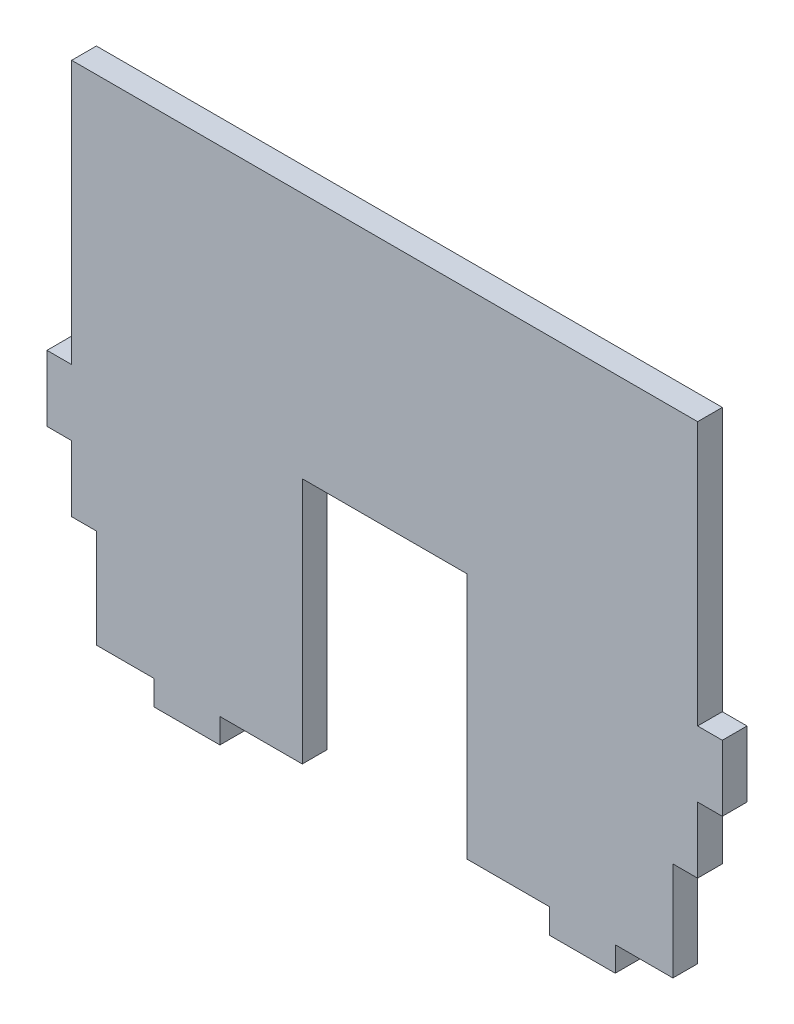
ISO-10303-21;
HEADER;
FILE_DESCRIPTION(('STEP AP214'),'2;1');
FILE_NAME('part.step','',(''),(''),'','','');
FILE_SCHEMA(('AUTOMOTIVE_DESIGN { 1 0 10303 214 1 1 1 1 }'));
ENDSEC;
DATA;
#1=APPLICATION_CONTEXT('core data for automotive mechanical design processes');
#2=APPLICATION_PROTOCOL_DEFINITION('international standard','automotive_design',2000,#1);
#3=PRODUCT_CONTEXT('',#1,'mechanical');
#4=PRODUCT('Part','Part','',(#3));
#5=PRODUCT_RELATED_PRODUCT_CATEGORY('part','',(#4));
#6=PRODUCT_DEFINITION_FORMATION('','',#4);
#7=PRODUCT_DEFINITION_CONTEXT('part definition',#1,'design');
#8=PRODUCT_DEFINITION('design','',#6,#7);
#9=PRODUCT_DEFINITION_SHAPE('','',#8);
#10=(LENGTH_UNIT() NAMED_UNIT(*) SI_UNIT(.MILLI.,.METRE.));
#11=(NAMED_UNIT(*) PLANE_ANGLE_UNIT() SI_UNIT($,.RADIAN.));
#12=(NAMED_UNIT(*) SI_UNIT($,.STERADIAN.) SOLID_ANGLE_UNIT());
#13=UNCERTAINTY_MEASURE_WITH_UNIT(LENGTH_MEASURE(1.E-05),#10,'distance_accuracy_value','');
#14=(GEOMETRIC_REPRESENTATION_CONTEXT(3) GLOBAL_UNCERTAINTY_ASSIGNED_CONTEXT((#13)) GLOBAL_UNIT_ASSIGNED_CONTEXT((#10,
#11,#12)) REPRESENTATION_CONTEXT('',''));
#15=CARTESIAN_POINT('',(0.,0.,0.));
#16=DIRECTION('',(0.,0.,1.));
#17=DIRECTION('',(1.,0.,0.));
#18=AXIS2_PLACEMENT_3D('',#15,#16,#17);
#19=CARTESIAN_POINT('',(58.,-3.,3.));
#20=DIRECTION('',(1.,0.,0.));
#21=DIRECTION('',(0.,0.,-1.));
#22=AXIS2_PLACEMENT_3D('',#19,#20,#21);
#23=PLANE('',#22);
#24=DIRECTION('',(0.,-1.,0.));
#25=VECTOR('',#24,1.);
#26=CARTESIAN_POINT('',(58.,-3.,0.));
#27=LINE('',#26,#25);
#28=CARTESIAN_POINT('',(58.,0.,0.));
#29=VERTEX_POINT('',#28);
#30=CARTESIAN_POINT('',(58.,-3.,0.));
#31=VERTEX_POINT('',#30);
#32=EDGE_CURVE('E249',#29,#31,#27,.T.);
#33=ORIENTED_EDGE('',*,*,#32,.T.);
#34=DIRECTION('',(0.,0.,-1.));
#35=VECTOR('',#34,1.);
#36=CARTESIAN_POINT('',(58.,-3.,3.));
#37=LINE('',#36,#35);
#38=CARTESIAN_POINT('',(58.,-3.,3.));
#39=VERTEX_POINT('',#38);
#40=EDGE_CURVE('E11',#39,#31,#37,.T.);
#41=ORIENTED_EDGE('',*,*,#40,.F.);
#42=DIRECTION('',(0.,-1.,0.));
#43=VECTOR('',#42,1.);
#44=CARTESIAN_POINT('',(58.,-3.,3.));
#45=LINE('',#44,#43);
#46=CARTESIAN_POINT('',(58.,0.,3.));
#47=VERTEX_POINT('',#46);
#48=EDGE_CURVE('E304',#47,#39,#45,.T.);
#49=ORIENTED_EDGE('',*,*,#48,.F.);
#50=DIRECTION('',(0.,0.,-1.));
#51=VECTOR('',#50,1.);
#52=CARTESIAN_POINT('',(58.,0.,3.));
#53=LINE('',#52,#51);
#54=EDGE_CURVE('E245',#47,#29,#53,.T.);
#55=ORIENTED_EDGE('',*,*,#54,.T.);
#56=EDGE_LOOP('',(#33,#41,#49,#55));
#57=FACE_BOUND('',#56,.T.);
#58=ADVANCED_FACE('F33',(#57),#23,.F.);
#59=CARTESIAN_POINT('',(66.,-3.,3.));
#60=DIRECTION('',(0.,1.,0.));
#61=DIRECTION('',(0.,0.,1.));
#62=AXIS2_PLACEMENT_3D('',#59,#60,#61);
#63=PLANE('',#62);
#64=DIRECTION('',(1.,0.,0.));
#65=VECTOR('',#64,1.);
#66=CARTESIAN_POINT('',(66.,-3.,0.));
#67=LINE('',#66,#65);
#68=CARTESIAN_POINT('',(66.,-3.,0.));
#69=VERTEX_POINT('',#68);
#70=EDGE_CURVE('E252',#31,#69,#67,.T.);
#71=ORIENTED_EDGE('',*,*,#70,.T.);
#72=DIRECTION('',(0.,0.,-1.));
#73=VECTOR('',#72,1.);
#74=CARTESIAN_POINT('',(66.,-3.,3.));
#75=LINE('',#74,#73);
#76=CARTESIAN_POINT('',(66.,-3.,3.));
#77=VERTEX_POINT('',#76);
#78=EDGE_CURVE('E41',#77,#69,#75,.T.);
#79=ORIENTED_EDGE('',*,*,#78,.F.);
#80=DIRECTION('',(1.,0.,0.));
#81=VECTOR('',#80,1.);
#82=CARTESIAN_POINT('',(66.,-3.,3.));
#83=LINE('',#82,#81);
#84=EDGE_CURVE('E151',#39,#77,#83,.T.);
#85=ORIENTED_EDGE('',*,*,#84,.F.);
#86=ORIENTED_EDGE('',*,*,#40,.T.);
#87=EDGE_LOOP('',(#71,#79,#85,#86));
#88=FACE_BOUND('',#87,.T.);
#89=ADVANCED_FACE('F461',(#88),#63,.F.);
#90=CARTESIAN_POINT('',(66.,0.,3.));
#91=DIRECTION('',(-1.,0.,0.));
#92=DIRECTION('',(0.,0.,1.));
#93=AXIS2_PLACEMENT_3D('',#90,#91,#92);
#94=PLANE('',#93);
#95=DIRECTION('',(0.,1.,0.));
#96=VECTOR('',#95,1.);
#97=CARTESIAN_POINT('',(66.,0.,0.));
#98=LINE('',#97,#96);
#99=CARTESIAN_POINT('',(66.,0.,0.));
#100=VERTEX_POINT('',#99);
#101=EDGE_CURVE('E254',#69,#100,#98,.T.);
#102=ORIENTED_EDGE('',*,*,#101,.T.);
#103=DIRECTION('',(0.,0.,-1.));
#104=VECTOR('',#103,1.);
#105=CARTESIAN_POINT('',(66.,0.,3.));
#106=LINE('',#105,#104);
#107=CARTESIAN_POINT('',(66.,0.,3.));
#108=VERTEX_POINT('',#107);
#109=EDGE_CURVE('E371',#108,#100,#106,.T.);
#110=ORIENTED_EDGE('',*,*,#109,.F.);
#111=DIRECTION('',(0.,1.,0.));
#112=VECTOR('',#111,1.);
#113=CARTESIAN_POINT('',(66.,0.,3.));
#114=LINE('',#113,#112);
#115=EDGE_CURVE('E379',#77,#108,#114,.T.);
#116=ORIENTED_EDGE('',*,*,#115,.F.);
#117=ORIENTED_EDGE('',*,*,#78,.T.);
#118=EDGE_LOOP('',(#102,#110,#116,#117));
#119=FACE_BOUND('',#118,.T.);
#120=ADVANCED_FACE('F377',(#119),#94,.F.);
#121=CARTESIAN_POINT('',(73.,0.,3.));
#122=DIRECTION('',(0.,1.,0.));
#123=DIRECTION('',(-1.,0.,0.));
#124=AXIS2_PLACEMENT_3D('',#121,#122,#123);
#125=PLANE('',#124);
#126=DIRECTION('',(1.,0.,0.));
#127=VECTOR('',#126,1.);
#128=CARTESIAN_POINT('',(73.,0.,0.));
#129=LINE('',#128,#127);
#130=CARTESIAN_POINT('',(73.,0.,0.));
#131=VERTEX_POINT('',#130);
#132=EDGE_CURVE('E256',#100,#131,#129,.T.);
#133=ORIENTED_EDGE('',*,*,#132,.T.);
#134=DIRECTION('',(0.,0.,-1.));
#135=VECTOR('',#134,1.);
#136=CARTESIAN_POINT('',(73.,0.,3.));
#137=LINE('',#136,#135);
#138=CARTESIAN_POINT('',(73.,0.,3.));
#139=VERTEX_POINT('',#138);
#140=EDGE_CURVE('E368',#139,#131,#137,.T.);
#141=ORIENTED_EDGE('',*,*,#140,.F.);
#142=DIRECTION('',(1.,0.,0.));
#143=VECTOR('',#142,1.);
#144=CARTESIAN_POINT('',(73.,0.,3.));
#145=LINE('',#144,#143);
#146=EDGE_CURVE('E397',#108,#139,#145,.T.);
#147=ORIENTED_EDGE('',*,*,#146,.F.);
#148=ORIENTED_EDGE('',*,*,#109,.T.);
#149=EDGE_LOOP('',(#133,#141,#147,#148));
#150=FACE_BOUND('',#149,.T.);
#151=ADVANCED_FACE('F388',(#150),#125,.F.);
#152=CARTESIAN_POINT('',(73.,0.,3.));
#153=DIRECTION('',(-1.,0.,0.));
#154=DIRECTION('',(0.,0.,1.));
#155=AXIS2_PLACEMENT_3D('',#152,#153,#154);
#156=PLANE('',#155);
#157=DIRECTION('',(0.,1.,0.));
#158=VECTOR('',#157,1.);
#159=CARTESIAN_POINT('',(73.,0.,0.));
#160=LINE('',#159,#158);
#161=CARTESIAN_POINT('',(73.,12.,0.));
#162=VERTEX_POINT('',#161);
#163=EDGE_CURVE('E258',#131,#162,#160,.T.);
#164=ORIENTED_EDGE('',*,*,#163,.T.);
#165=DIRECTION('',(0.,0.,-1.));
#166=VECTOR('',#165,1.);
#167=CARTESIAN_POINT('',(73.,12.,3.));
#168=LINE('',#167,#166);
#169=CARTESIAN_POINT('',(73.,12.,3.));
#170=VERTEX_POINT('',#169);
#171=EDGE_CURVE('E365',#170,#162,#168,.T.);
#172=ORIENTED_EDGE('',*,*,#171,.F.);
#173=DIRECTION('',(0.,1.,0.));
#174=VECTOR('',#173,1.);
#175=CARTESIAN_POINT('',(73.,0.,3.));
#176=LINE('',#175,#174);
#177=EDGE_CURVE('E394',#139,#170,#176,.T.);
#178=ORIENTED_EDGE('',*,*,#177,.F.);
#179=ORIENTED_EDGE('',*,*,#140,.T.);
#180=EDGE_LOOP('',(#164,#172,#178,#179));
#181=FACE_BOUND('',#180,.T.);
#182=ADVANCED_FACE('F392',(#181),#156,.F.);
#183=CARTESIAN_POINT('',(73.,12.,3.));
#184=DIRECTION('',(0.,1.,0.));
#185=DIRECTION('',(0.,0.,1.));
#186=AXIS2_PLACEMENT_3D('',#183,#184,#185);
#187=PLANE('',#186);
#188=DIRECTION('',(1.,0.,0.));
#189=VECTOR('',#188,1.);
#190=CARTESIAN_POINT('',(73.,12.,0.));
#191=LINE('',#190,#189);
#192=CARTESIAN_POINT('',(76.,12.,0.));
#193=VERTEX_POINT('',#192);
#194=EDGE_CURVE('E260',#162,#193,#191,.T.);
#195=ORIENTED_EDGE('',*,*,#194,.T.);
#196=DIRECTION('',(0.,0.,-1.));
#197=VECTOR('',#196,1.);
#198=CARTESIAN_POINT('',(76.,12.,3.));
#199=LINE('',#198,#197);
#200=CARTESIAN_POINT('',(76.,12.,3.));
#201=VERTEX_POINT('',#200);
#202=EDGE_CURVE('E362',#201,#193,#199,.T.);
#203=ORIENTED_EDGE('',*,*,#202,.F.);
#204=DIRECTION('',(1.,0.,0.));
#205=VECTOR('',#204,1.);
#206=CARTESIAN_POINT('',(73.,12.,3.));
#207=LINE('',#206,#205);
#208=EDGE_CURVE('E396',#170,#201,#207,.T.);
#209=ORIENTED_EDGE('',*,*,#208,.F.);
#210=ORIENTED_EDGE('',*,*,#171,.T.);
#211=EDGE_LOOP('',(#195,#203,#209,#210));
#212=FACE_BOUND('',#211,.T.);
#213=ADVANCED_FACE('F474',(#212),#187,.F.);
#214=CARTESIAN_POINT('',(76.,12.,3.));
#215=DIRECTION('',(-1.,0.,0.));
#216=DIRECTION('',(0.,0.,1.));
#217=AXIS2_PLACEMENT_3D('',#214,#215,#216);
#218=PLANE('',#217);
#219=DIRECTION('',(0.,1.,0.));
#220=VECTOR('',#219,1.);
#221=CARTESIAN_POINT('',(76.,12.,0.));
#222=LINE('',#221,#220);
#223=CARTESIAN_POINT('',(76.,20.,0.));
#224=VERTEX_POINT('',#223);
#225=EDGE_CURVE('E262',#193,#224,#222,.T.);
#226=ORIENTED_EDGE('',*,*,#225,.T.);
#227=DIRECTION('',(0.,0.,-1.));
#228=VECTOR('',#227,1.);
#229=CARTESIAN_POINT('',(76.,20.,3.));
#230=LINE('',#229,#228);
#231=CARTESIAN_POINT('',(76.,20.,3.));
#232=VERTEX_POINT('',#231);
#233=EDGE_CURVE('E359',#232,#224,#230,.T.);
#234=ORIENTED_EDGE('',*,*,#233,.F.);
#235=DIRECTION('',(0.,1.,0.));
#236=VECTOR('',#235,1.);
#237=CARTESIAN_POINT('',(76.,12.,3.));
#238=LINE('',#237,#236);
#239=EDGE_CURVE('E399',#201,#232,#238,.T.);
#240=ORIENTED_EDGE('',*,*,#239,.F.);
#241=ORIENTED_EDGE('',*,*,#202,.T.);
#242=EDGE_LOOP('',(#226,#234,#240,#241));
#243=FACE_BOUND('',#242,.T.);
#244=ADVANCED_FACE('F477',(#243),#218,.F.);
#245=CARTESIAN_POINT('',(79.,20.,3.));
#246=DIRECTION('',(0.,1.,0.));
#247=DIRECTION('',(0.,0.,1.));
#248=AXIS2_PLACEMENT_3D('',#245,#246,#247);
#249=PLANE('',#248);
#250=DIRECTION('',(1.,0.,0.));
#251=VECTOR('',#250,1.);
#252=CARTESIAN_POINT('',(79.,20.,0.));
#253=LINE('',#252,#251);
#254=CARTESIAN_POINT('',(79.,20.,0.));
#255=VERTEX_POINT('',#254);
#256=EDGE_CURVE('E264',#224,#255,#253,.T.);
#257=ORIENTED_EDGE('',*,*,#256,.T.);
#258=DIRECTION('',(0.,0.,-1.));
#259=VECTOR('',#258,1.);
#260=CARTESIAN_POINT('',(79.,20.,3.));
#261=LINE('',#260,#259);
#262=CARTESIAN_POINT('',(79.,20.,3.));
#263=VERTEX_POINT('',#262);
#264=EDGE_CURVE('E356',#263,#255,#261,.T.);
#265=ORIENTED_EDGE('',*,*,#264,.F.);
#266=DIRECTION('',(1.,0.,0.));
#267=VECTOR('',#266,1.);
#268=CARTESIAN_POINT('',(79.,20.,3.));
#269=LINE('',#268,#267);
#270=EDGE_CURVE('E405',#232,#263,#269,.T.);
#271=ORIENTED_EDGE('',*,*,#270,.F.);
#272=ORIENTED_EDGE('',*,*,#233,.T.);
#273=EDGE_LOOP('',(#257,#265,#271,#272));
#274=FACE_BOUND('',#273,.T.);
#275=ADVANCED_FACE('F481',(#274),#249,.F.);
#276=CARTESIAN_POINT('',(79.,28.,3.));
#277=DIRECTION('',(-1.,0.,0.));
#278=DIRECTION('',(0.,0.,1.));
#279=AXIS2_PLACEMENT_3D('',#276,#277,#278);
#280=PLANE('',#279);
#281=DIRECTION('',(0.,1.,0.));
#282=VECTOR('',#281,1.);
#283=CARTESIAN_POINT('',(79.,28.,0.));
#284=LINE('',#283,#282);
#285=CARTESIAN_POINT('',(79.,28.,0.));
#286=VERTEX_POINT('',#285);
#287=EDGE_CURVE('E266',#255,#286,#284,.T.);
#288=ORIENTED_EDGE('',*,*,#287,.T.);
#289=DIRECTION('',(0.,0.,-1.));
#290=VECTOR('',#289,1.);
#291=CARTESIAN_POINT('',(79.,28.,3.));
#292=LINE('',#291,#290);
#293=CARTESIAN_POINT('',(79.,28.,3.));
#294=VERTEX_POINT('',#293);
#295=EDGE_CURVE('E353',#294,#286,#292,.T.);
#296=ORIENTED_EDGE('',*,*,#295,.F.);
#297=DIRECTION('',(0.,1.,0.));
#298=VECTOR('',#297,1.);
#299=CARTESIAN_POINT('',(79.,28.,3.));
#300=LINE('',#299,#298);
#301=EDGE_CURVE('E407',#263,#294,#300,.T.);
#302=ORIENTED_EDGE('',*,*,#301,.F.);
#303=ORIENTED_EDGE('',*,*,#264,.T.);
#304=EDGE_LOOP('',(#288,#296,#302,#303));
#305=FACE_BOUND('',#304,.T.);
#306=ADVANCED_FACE('F485',(#305),#280,.F.);
#307=CARTESIAN_POINT('',(76.,28.,3.));
#308=DIRECTION('',(0.,-1.,0.));
#309=DIRECTION('',(0.,0.,-1.));
#310=AXIS2_PLACEMENT_3D('',#307,#308,#309);
#311=PLANE('',#310);
#312=DIRECTION('',(-1.,0.,0.));
#313=VECTOR('',#312,1.);
#314=CARTESIAN_POINT('',(76.,28.,0.));
#315=LINE('',#314,#313);
#316=CARTESIAN_POINT('',(76.,28.,0.));
#317=VERTEX_POINT('',#316);
#318=EDGE_CURVE('E268',#286,#317,#315,.T.);
#319=ORIENTED_EDGE('',*,*,#318,.T.);
#320=DIRECTION('',(0.,0.,-1.));
#321=VECTOR('',#320,1.);
#322=CARTESIAN_POINT('',(76.,28.,3.));
#323=LINE('',#322,#321);
#324=CARTESIAN_POINT('',(76.,28.,3.));
#325=VERTEX_POINT('',#324);
#326=EDGE_CURVE('E350',#325,#317,#323,.T.);
#327=ORIENTED_EDGE('',*,*,#326,.F.);
#328=DIRECTION('',(-1.,0.,0.));
#329=VECTOR('',#328,1.);
#330=CARTESIAN_POINT('',(76.,28.,3.));
#331=LINE('',#330,#329);
#332=EDGE_CURVE('E409',#294,#325,#331,.T.);
#333=ORIENTED_EDGE('',*,*,#332,.F.);
#334=ORIENTED_EDGE('',*,*,#295,.T.);
#335=EDGE_LOOP('',(#319,#327,#333,#334));
#336=FACE_BOUND('',#335,.T.);
#337=ADVANCED_FACE('F489',(#336),#311,.F.);
#338=CARTESIAN_POINT('',(76.,28.,3.));
#339=DIRECTION('',(-1.,0.,0.));
#340=DIRECTION('',(0.,-1.,0.));
#341=AXIS2_PLACEMENT_3D('',#338,#339,#340);
#342=PLANE('',#341);
#343=DIRECTION('',(0.,1.,0.));
#344=VECTOR('',#343,1.);
#345=CARTESIAN_POINT('',(76.,28.,0.));
#346=LINE('',#345,#344);
#347=CARTESIAN_POINT('',(76.,60.,0.));
#348=VERTEX_POINT('',#347);
#349=EDGE_CURVE('E270',#317,#348,#346,.T.);
#350=ORIENTED_EDGE('',*,*,#349,.T.);
#351=DIRECTION('',(0.,0.,-1.));
#352=VECTOR('',#351,1.);
#353=CARTESIAN_POINT('',(76.,60.,3.));
#354=LINE('',#353,#352);
#355=CARTESIAN_POINT('',(76.,60.,3.));
#356=VERTEX_POINT('',#355);
#357=EDGE_CURVE('E347',#356,#348,#354,.T.);
#358=ORIENTED_EDGE('',*,*,#357,.F.);
#359=DIRECTION('',(0.,1.,0.));
#360=VECTOR('',#359,1.);
#361=CARTESIAN_POINT('',(76.,28.,3.));
#362=LINE('',#361,#360);
#363=EDGE_CURVE('E411',#325,#356,#362,.T.);
#364=ORIENTED_EDGE('',*,*,#363,.F.);
#365=ORIENTED_EDGE('',*,*,#326,.T.);
#366=EDGE_LOOP('',(#350,#358,#364,#365));
#367=FACE_BOUND('',#366,.T.);
#368=ADVANCED_FACE('F493',(#367),#342,.F.);
#369=CARTESIAN_POINT('',(0.,60.,3.));
#370=DIRECTION('',(0.,-1.,0.));
#371=DIRECTION('',(1.,0.,0.));
#372=AXIS2_PLACEMENT_3D('',#369,#370,#371);
#373=PLANE('',#372);
#374=DIRECTION('',(-1.,0.,0.));
#375=VECTOR('',#374,1.);
#376=CARTESIAN_POINT('',(0.,60.,0.));
#377=LINE('',#376,#375);
#378=CARTESIAN_POINT('',(0.,60.,0.));
#379=VERTEX_POINT('',#378);
#380=EDGE_CURVE('E272',#348,#379,#377,.T.);
#381=ORIENTED_EDGE('',*,*,#380,.T.);
#382=DIRECTION('',(0.,0.,-1.));
#383=VECTOR('',#382,1.);
#384=CARTESIAN_POINT('',(0.,60.,3.));
#385=LINE('',#384,#383);
#386=CARTESIAN_POINT('',(0.,60.,3.));
#387=VERTEX_POINT('',#386);
#388=EDGE_CURVE('E344',#387,#379,#385,.T.);
#389=ORIENTED_EDGE('',*,*,#388,.F.);
#390=DIRECTION('',(-1.,0.,0.));
#391=VECTOR('',#390,1.);
#392=CARTESIAN_POINT('',(0.,60.,3.));
#393=LINE('',#392,#391);
#394=EDGE_CURVE('E413',#356,#387,#393,.T.);
#395=ORIENTED_EDGE('',*,*,#394,.F.);
#396=ORIENTED_EDGE('',*,*,#357,.T.);
#397=EDGE_LOOP('',(#381,#389,#395,#396));
#398=FACE_BOUND('',#397,.T.);
#399=ADVANCED_FACE('F497',(#398),#373,.F.);
#400=CARTESIAN_POINT('',(0.,28.,3.));
#401=DIRECTION('',(1.,0.,0.));
#402=DIRECTION('',(0.,0.,-1.));
#403=AXIS2_PLACEMENT_3D('',#400,#401,#402);
#404=PLANE('',#403);
#405=DIRECTION('',(0.,-1.,0.));
#406=VECTOR('',#405,1.);
#407=CARTESIAN_POINT('',(0.,28.,0.));
#408=LINE('',#407,#406);
#409=CARTESIAN_POINT('',(0.,28.,0.));
#410=VERTEX_POINT('',#409);
#411=EDGE_CURVE('E274',#379,#410,#408,.T.);
#412=ORIENTED_EDGE('',*,*,#411,.T.);
#413=DIRECTION('',(0.,0.,-1.));
#414=VECTOR('',#413,1.);
#415=CARTESIAN_POINT('',(0.,28.,3.));
#416=LINE('',#415,#414);
#417=CARTESIAN_POINT('',(0.,28.,3.));
#418=VERTEX_POINT('',#417);
#419=EDGE_CURVE('E341',#418,#410,#416,.T.);
#420=ORIENTED_EDGE('',*,*,#419,.F.);
#421=DIRECTION('',(0.,-1.,0.));
#422=VECTOR('',#421,1.);
#423=CARTESIAN_POINT('',(0.,28.,3.));
#424=LINE('',#423,#422);
#425=EDGE_CURVE('E415',#387,#418,#424,.T.);
#426=ORIENTED_EDGE('',*,*,#425,.F.);
#427=ORIENTED_EDGE('',*,*,#388,.T.);
#428=EDGE_LOOP('',(#412,#420,#426,#427));
#429=FACE_BOUND('',#428,.T.);
#430=ADVANCED_FACE('F501',(#429),#404,.F.);
#431=CARTESIAN_POINT('',(0.,28.,3.));
#432=DIRECTION('',(0.,-1.,0.));
#433=DIRECTION('',(0.,0.,-1.));
#434=AXIS2_PLACEMENT_3D('',#431,#432,#433);
#435=PLANE('',#434);
#436=DIRECTION('',(-1.,0.,0.));
#437=VECTOR('',#436,1.);
#438=CARTESIAN_POINT('',(0.,28.,0.));
#439=LINE('',#438,#437);
#440=CARTESIAN_POINT('',(-3.,28.,0.));
#441=VERTEX_POINT('',#440);
#442=EDGE_CURVE('E276',#410,#441,#439,.T.);
#443=ORIENTED_EDGE('',*,*,#442,.T.);
#444=DIRECTION('',(0.,0.,-1.));
#445=VECTOR('',#444,1.);
#446=CARTESIAN_POINT('',(-3.,28.,3.));
#447=LINE('',#446,#445);
#448=CARTESIAN_POINT('',(-3.,28.,3.));
#449=VERTEX_POINT('',#448);
#450=EDGE_CURVE('E338',#449,#441,#447,.T.);
#451=ORIENTED_EDGE('',*,*,#450,.F.);
#452=DIRECTION('',(-1.,0.,0.));
#453=VECTOR('',#452,1.);
#454=CARTESIAN_POINT('',(0.,28.,3.));
#455=LINE('',#454,#453);
#456=EDGE_CURVE('E417',#418,#449,#455,.T.);
#457=ORIENTED_EDGE('',*,*,#456,.F.);
#458=ORIENTED_EDGE('',*,*,#419,.T.);
#459=EDGE_LOOP('',(#443,#451,#457,#458));
#460=FACE_BOUND('',#459,.T.);
#461=ADVANCED_FACE('F505',(#460),#435,.F.);
#462=CARTESIAN_POINT('',(-3.,28.,3.));
#463=DIRECTION('',(1.,0.,0.));
#464=DIRECTION('',(0.,1.,0.));
#465=AXIS2_PLACEMENT_3D('',#462,#463,#464);
#466=PLANE('',#465);
#467=DIRECTION('',(0.,-1.,0.));
#468=VECTOR('',#467,1.);
#469=CARTESIAN_POINT('',(-3.,28.,0.));
#470=LINE('',#469,#468);
#471=CARTESIAN_POINT('',(-3.,20.,0.));
#472=VERTEX_POINT('',#471);
#473=EDGE_CURVE('E278',#441,#472,#470,.T.);
#474=ORIENTED_EDGE('',*,*,#473,.T.);
#475=DIRECTION('',(0.,0.,-1.));
#476=VECTOR('',#475,1.);
#477=CARTESIAN_POINT('',(-3.,20.,3.));
#478=LINE('',#477,#476);
#479=CARTESIAN_POINT('',(-3.,20.,3.));
#480=VERTEX_POINT('',#479);
#481=EDGE_CURVE('E335',#480,#472,#478,.T.);
#482=ORIENTED_EDGE('',*,*,#481,.F.);
#483=DIRECTION('',(0.,-1.,0.));
#484=VECTOR('',#483,1.);
#485=CARTESIAN_POINT('',(-3.,28.,3.));
#486=LINE('',#485,#484);
#487=EDGE_CURVE('E419',#449,#480,#486,.T.);
#488=ORIENTED_EDGE('',*,*,#487,.F.);
#489=ORIENTED_EDGE('',*,*,#450,.T.);
#490=EDGE_LOOP('',(#474,#482,#488,#489));
#491=FACE_BOUND('',#490,.T.);
#492=ADVANCED_FACE('F509',(#491),#466,.F.);
#493=CARTESIAN_POINT('',(-3.,20.,3.));
#494=DIRECTION('',(0.,1.,0.));
#495=DIRECTION('',(0.,0.,1.));
#496=AXIS2_PLACEMENT_3D('',#493,#494,#495);
#497=PLANE('',#496);
#498=DIRECTION('',(1.,0.,0.));
#499=VECTOR('',#498,1.);
#500=CARTESIAN_POINT('',(-3.,20.,0.));
#501=LINE('',#500,#499);
#502=CARTESIAN_POINT('',(0.,20.,0.));
#503=VERTEX_POINT('',#502);
#504=EDGE_CURVE('E280',#472,#503,#501,.T.);
#505=ORIENTED_EDGE('',*,*,#504,.T.);
#506=DIRECTION('',(0.,0.,-1.));
#507=VECTOR('',#506,1.);
#508=CARTESIAN_POINT('',(0.,20.,3.));
#509=LINE('',#508,#507);
#510=CARTESIAN_POINT('',(0.,20.,3.));
#511=VERTEX_POINT('',#510);
#512=EDGE_CURVE('E332',#511,#503,#509,.T.);
#513=ORIENTED_EDGE('',*,*,#512,.F.);
#514=DIRECTION('',(1.,0.,0.));
#515=VECTOR('',#514,1.);
#516=CARTESIAN_POINT('',(-3.,20.,3.));
#517=LINE('',#516,#515);
#518=EDGE_CURVE('E421',#480,#511,#517,.T.);
#519=ORIENTED_EDGE('',*,*,#518,.F.);
#520=ORIENTED_EDGE('',*,*,#481,.T.);
#521=EDGE_LOOP('',(#505,#513,#519,#520));
#522=FACE_BOUND('',#521,.T.);
#523=ADVANCED_FACE('F513',(#522),#497,.F.);
#524=CARTESIAN_POINT('',(0.,12.,3.));
#525=DIRECTION('',(1.,0.,0.));
#526=DIRECTION('',(0.,0.,-1.));
#527=AXIS2_PLACEMENT_3D('',#524,#525,#526);
#528=PLANE('',#527);
#529=DIRECTION('',(0.,-1.,0.));
#530=VECTOR('',#529,1.);
#531=CARTESIAN_POINT('',(0.,12.,0.));
#532=LINE('',#531,#530);
#533=CARTESIAN_POINT('',(0.,12.,0.));
#534=VERTEX_POINT('',#533);
#535=EDGE_CURVE('E282',#503,#534,#532,.T.);
#536=ORIENTED_EDGE('',*,*,#535,.T.);
#537=DIRECTION('',(0.,0.,-1.));
#538=VECTOR('',#537,1.);
#539=CARTESIAN_POINT('',(0.,12.,3.));
#540=LINE('',#539,#538);
#541=CARTESIAN_POINT('',(0.,12.,3.));
#542=VERTEX_POINT('',#541);
#543=EDGE_CURVE('E329',#542,#534,#540,.T.);
#544=ORIENTED_EDGE('',*,*,#543,.F.);
#545=DIRECTION('',(0.,-1.,0.));
#546=VECTOR('',#545,1.);
#547=CARTESIAN_POINT('',(0.,12.,3.));
#548=LINE('',#547,#546);
#549=EDGE_CURVE('E423',#511,#542,#548,.T.);
#550=ORIENTED_EDGE('',*,*,#549,.F.);
#551=ORIENTED_EDGE('',*,*,#512,.T.);
#552=EDGE_LOOP('',(#536,#544,#550,#551));
#553=FACE_BOUND('',#552,.T.);
#554=ADVANCED_FACE('F517',(#553),#528,.F.);
#555=CARTESIAN_POINT('',(0.,12.,3.));
#556=DIRECTION('',(0.,1.,0.));
#557=DIRECTION('',(0.,0.,1.));
#558=AXIS2_PLACEMENT_3D('',#555,#556,#557);
#559=PLANE('',#558);
#560=DIRECTION('',(1.,0.,0.));
#561=VECTOR('',#560,1.);
#562=CARTESIAN_POINT('',(0.,12.,0.));
#563=LINE('',#562,#561);
#564=CARTESIAN_POINT('',(3.,12.,0.));
#565=VERTEX_POINT('',#564);
#566=EDGE_CURVE('E284',#534,#565,#563,.T.);
#567=ORIENTED_EDGE('',*,*,#566,.T.);
#568=DIRECTION('',(0.,0.,-1.));
#569=VECTOR('',#568,1.);
#570=CARTESIAN_POINT('',(3.,12.,3.));
#571=LINE('',#570,#569);
#572=CARTESIAN_POINT('',(3.,12.,3.));
#573=VERTEX_POINT('',#572);
#574=EDGE_CURVE('E326',#573,#565,#571,.T.);
#575=ORIENTED_EDGE('',*,*,#574,.F.);
#576=DIRECTION('',(1.,0.,0.));
#577=VECTOR('',#576,1.);
#578=CARTESIAN_POINT('',(0.,12.,3.));
#579=LINE('',#578,#577);
#580=EDGE_CURVE('E425',#542,#573,#579,.T.);
#581=ORIENTED_EDGE('',*,*,#580,.F.);
#582=ORIENTED_EDGE('',*,*,#543,.T.);
#583=EDGE_LOOP('',(#567,#575,#581,#582));
#584=FACE_BOUND('',#583,.T.);
#585=ADVANCED_FACE('F521',(#584),#559,.F.);
#586=CARTESIAN_POINT('',(3.,12.,3.));
#587=DIRECTION('',(1.,0.,0.));
#588=DIRECTION('',(0.,0.,-1.));
#589=AXIS2_PLACEMENT_3D('',#586,#587,#588);
#590=PLANE('',#589);
#591=DIRECTION('',(0.,-1.,0.));
#592=VECTOR('',#591,1.);
#593=CARTESIAN_POINT('',(3.,12.,0.));
#594=LINE('',#593,#592);
#595=CARTESIAN_POINT('',(3.,0.,0.));
#596=VERTEX_POINT('',#595);
#597=EDGE_CURVE('E286',#565,#596,#594,.T.);
#598=ORIENTED_EDGE('',*,*,#597,.T.);
#599=DIRECTION('',(0.,0.,-1.));
#600=VECTOR('',#599,1.);
#601=CARTESIAN_POINT('',(3.,0.,3.));
#602=LINE('',#601,#600);
#603=CARTESIAN_POINT('',(3.,0.,3.));
#604=VERTEX_POINT('',#603);
#605=EDGE_CURVE('E323',#604,#596,#602,.T.);
#606=ORIENTED_EDGE('',*,*,#605,.F.);
#607=DIRECTION('',(0.,-1.,0.));
#608=VECTOR('',#607,1.);
#609=CARTESIAN_POINT('',(3.,12.,3.));
#610=LINE('',#609,#608);
#611=EDGE_CURVE('E427',#573,#604,#610,.T.);
#612=ORIENTED_EDGE('',*,*,#611,.F.);
#613=ORIENTED_EDGE('',*,*,#574,.T.);
#614=EDGE_LOOP('',(#598,#606,#612,#613));
#615=FACE_BOUND('',#614,.T.);
#616=ADVANCED_FACE('F525',(#615),#590,.F.);
#617=CARTESIAN_POINT('',(3.,0.,3.));
#618=DIRECTION('',(0.,1.,0.));
#619=DIRECTION('',(0.,0.,1.));
#620=AXIS2_PLACEMENT_3D('',#617,#618,#619);
#621=PLANE('',#620);
#622=DIRECTION('',(1.,0.,0.));
#623=VECTOR('',#622,1.);
#624=CARTESIAN_POINT('',(3.,0.,0.));
#625=LINE('',#624,#623);
#626=CARTESIAN_POINT('',(10.,0.,0.));
#627=VERTEX_POINT('',#626);
#628=EDGE_CURVE('E288',#596,#627,#625,.T.);
#629=ORIENTED_EDGE('',*,*,#628,.T.);
#630=DIRECTION('',(0.,0.,-1.));
#631=VECTOR('',#630,1.);
#632=CARTESIAN_POINT('',(10.,0.,3.));
#633=LINE('',#632,#631);
#634=CARTESIAN_POINT('',(10.,0.,3.));
#635=VERTEX_POINT('',#634);
#636=EDGE_CURVE('E320',#635,#627,#633,.T.);
#637=ORIENTED_EDGE('',*,*,#636,.F.);
#638=DIRECTION('',(1.,0.,0.));
#639=VECTOR('',#638,1.);
#640=CARTESIAN_POINT('',(3.,0.,3.));
#641=LINE('',#640,#639);
#642=EDGE_CURVE('E429',#604,#635,#641,.T.);
#643=ORIENTED_EDGE('',*,*,#642,.F.);
#644=ORIENTED_EDGE('',*,*,#605,.T.);
#645=EDGE_LOOP('',(#629,#637,#643,#644));
#646=FACE_BOUND('',#645,.T.);
#647=ADVANCED_FACE('F529',(#646),#621,.F.);
#648=CARTESIAN_POINT('',(10.,0.,3.));
#649=DIRECTION('',(1.,0.,0.));
#650=DIRECTION('',(0.,0.,-1.));
#651=AXIS2_PLACEMENT_3D('',#648,#649,#650);
#652=PLANE('',#651);
#653=DIRECTION('',(0.,-1.,0.));
#654=VECTOR('',#653,1.);
#655=CARTESIAN_POINT('',(10.,0.,0.));
#656=LINE('',#655,#654);
#657=CARTESIAN_POINT('',(10.,-3.,0.));
#658=VERTEX_POINT('',#657);
#659=EDGE_CURVE('E290',#627,#658,#656,.T.);
#660=ORIENTED_EDGE('',*,*,#659,.T.);
#661=DIRECTION('',(0.,0.,-1.));
#662=VECTOR('',#661,1.);
#663=CARTESIAN_POINT('',(10.,-3.,3.));
#664=LINE('',#663,#662);
#665=CARTESIAN_POINT('',(10.,-3.,3.));
#666=VERTEX_POINT('',#665);
#667=EDGE_CURVE('E317',#666,#658,#664,.T.);
#668=ORIENTED_EDGE('',*,*,#667,.F.);
#669=DIRECTION('',(0.,-1.,0.));
#670=VECTOR('',#669,1.);
#671=CARTESIAN_POINT('',(10.,0.,3.));
#672=LINE('',#671,#670);
#673=EDGE_CURVE('E431',#635,#666,#672,.T.);
#674=ORIENTED_EDGE('',*,*,#673,.F.);
#675=ORIENTED_EDGE('',*,*,#636,.T.);
#676=EDGE_LOOP('',(#660,#668,#674,#675));
#677=FACE_BOUND('',#676,.T.);
#678=ADVANCED_FACE('F533',(#677),#652,.F.);
#679=CARTESIAN_POINT('',(10.,-3.,3.));
#680=DIRECTION('',(0.,1.,0.));
#681=DIRECTION('',(0.,0.,1.));
#682=AXIS2_PLACEMENT_3D('',#679,#680,#681);
#683=PLANE('',#682);
#684=DIRECTION('',(1.,0.,0.));
#685=VECTOR('',#684,1.);
#686=CARTESIAN_POINT('',(10.,-3.,0.));
#687=LINE('',#686,#685);
#688=CARTESIAN_POINT('',(18.,-3.,0.));
#689=VERTEX_POINT('',#688);
#690=EDGE_CURVE('E292',#658,#689,#687,.T.);
#691=ORIENTED_EDGE('',*,*,#690,.T.);
#692=DIRECTION('',(0.,0.,-1.));
#693=VECTOR('',#692,1.);
#694=CARTESIAN_POINT('',(18.,-3.,3.));
#695=LINE('',#694,#693);
#696=CARTESIAN_POINT('',(18.,-3.,3.));
#697=VERTEX_POINT('',#696);
#698=EDGE_CURVE('E314',#697,#689,#695,.T.);
#699=ORIENTED_EDGE('',*,*,#698,.F.);
#700=DIRECTION('',(1.,0.,0.));
#701=VECTOR('',#700,1.);
#702=CARTESIAN_POINT('',(10.,-3.,3.));
#703=LINE('',#702,#701);
#704=EDGE_CURVE('E433',#666,#697,#703,.T.);
#705=ORIENTED_EDGE('',*,*,#704,.F.);
#706=ORIENTED_EDGE('',*,*,#667,.T.);
#707=EDGE_LOOP('',(#691,#699,#705,#706));
#708=FACE_BOUND('',#707,.T.);
#709=ADVANCED_FACE('F537',(#708),#683,.F.);
#710=CARTESIAN_POINT('',(18.,-3.,3.));
#711=DIRECTION('',(-1.,0.,0.));
#712=DIRECTION('',(0.,0.,1.));
#713=AXIS2_PLACEMENT_3D('',#710,#711,#712);
#714=PLANE('',#713);
#715=DIRECTION('',(0.,1.,0.));
#716=VECTOR('',#715,1.);
#717=CARTESIAN_POINT('',(18.,-3.,0.));
#718=LINE('',#717,#716);
#719=CARTESIAN_POINT('',(18.,0.,0.));
#720=VERTEX_POINT('',#719);
#721=EDGE_CURVE('E294',#689,#720,#718,.T.);
#722=ORIENTED_EDGE('',*,*,#721,.T.);
#723=DIRECTION('',(0.,0.,-1.));
#724=VECTOR('',#723,1.);
#725=CARTESIAN_POINT('',(18.,0.,3.));
#726=LINE('',#725,#724);
#727=CARTESIAN_POINT('',(18.,0.,3.));
#728=VERTEX_POINT('',#727);
#729=EDGE_CURVE('E311',#728,#720,#726,.T.);
#730=ORIENTED_EDGE('',*,*,#729,.F.);
#731=DIRECTION('',(0.,1.,0.));
#732=VECTOR('',#731,1.);
#733=CARTESIAN_POINT('',(18.,-3.,3.));
#734=LINE('',#733,#732);
#735=EDGE_CURVE('E435',#697,#728,#734,.T.);
#736=ORIENTED_EDGE('',*,*,#735,.F.);
#737=ORIENTED_EDGE('',*,*,#698,.T.);
#738=EDGE_LOOP('',(#722,#730,#736,#737));
#739=FACE_BOUND('',#738,.T.);
#740=ADVANCED_FACE('F541',(#739),#714,.F.);
#741=CARTESIAN_POINT('',(18.,0.,3.));
#742=DIRECTION('',(0.,1.,0.));
#743=DIRECTION('',(0.,0.,1.));
#744=AXIS2_PLACEMENT_3D('',#741,#742,#743);
#745=PLANE('',#744);
#746=DIRECTION('',(1.,0.,0.));
#747=VECTOR('',#746,1.);
#748=CARTESIAN_POINT('',(18.,0.,0.));
#749=LINE('',#748,#747);
#750=CARTESIAN_POINT('',(28.,0.,0.));
#751=VERTEX_POINT('',#750);
#752=EDGE_CURVE('E296',#720,#751,#749,.T.);
#753=ORIENTED_EDGE('',*,*,#752,.T.);
#754=DIRECTION('',(0.,0.,-1.));
#755=VECTOR('',#754,1.);
#756=CARTESIAN_POINT('',(28.,0.,3.));
#757=LINE('',#756,#755);
#758=CARTESIAN_POINT('',(28.,0.,3.));
#759=VERTEX_POINT('',#758);
#760=EDGE_CURVE('E308',#759,#751,#757,.T.);
#761=ORIENTED_EDGE('',*,*,#760,.F.);
#762=DIRECTION('',(1.,0.,0.));
#763=VECTOR('',#762,1.);
#764=CARTESIAN_POINT('',(18.,0.,3.));
#765=LINE('',#764,#763);
#766=EDGE_CURVE('E437',#728,#759,#765,.T.);
#767=ORIENTED_EDGE('',*,*,#766,.F.);
#768=ORIENTED_EDGE('',*,*,#729,.T.);
#769=EDGE_LOOP('',(#753,#761,#767,#768));
#770=FACE_BOUND('',#769,.T.);
#771=ADVANCED_FACE('F443',(#770),#745,.F.);
#772=CARTESIAN_POINT('',(28.,4.94295662001811,3.));
#773=DIRECTION('',(-1.,0.,0.));
#774=DIRECTION('',(0.,0.,1.));
#775=AXIS2_PLACEMENT_3D('',#772,#773,#774);
#776=PLANE('',#775);
#777=DIRECTION('',(0.,1.,0.));
#778=VECTOR('',#777,1.);
#779=CARTESIAN_POINT('',(28.,4.94295662001811,0.));
#780=LINE('',#779,#778);
#781=CARTESIAN_POINT('',(28.,30.,0.));
#782=VERTEX_POINT('',#781);
#783=EDGE_CURVE('E299',#751,#782,#780,.T.);
#784=ORIENTED_EDGE('',*,*,#783,.T.);
#785=DIRECTION('',(0.,0.,-1.));
#786=VECTOR('',#785,1.);
#787=CARTESIAN_POINT('',(28.,30.,3.));
#788=LINE('',#787,#786);
#789=CARTESIAN_POINT('',(28.,30.,3.));
#790=VERTEX_POINT('',#789);
#791=EDGE_CURVE('E240',#790,#782,#788,.T.);
#792=ORIENTED_EDGE('',*,*,#791,.F.);
#793=DIRECTION('',(0.,1.,0.));
#794=VECTOR('',#793,1.);
#795=CARTESIAN_POINT('',(28.,0.,3.));
#796=LINE('',#795,#794);
#797=EDGE_CURVE('E230',#759,#790,#796,.T.);
#798=ORIENTED_EDGE('',*,*,#797,.F.);
#799=ORIENTED_EDGE('',*,*,#760,.T.);
#800=EDGE_LOOP('',(#784,#792,#798,#799));
#801=FACE_BOUND('',#800,.T.);
#802=ADVANCED_FACE('F446',(#801),#776,.F.);
#803=CARTESIAN_POINT('',(28.,30.,3.));
#804=DIRECTION('',(0.,1.,0.));
#805=DIRECTION('',(0.,0.,1.));
#806=AXIS2_PLACEMENT_3D('',#803,#804,#805);
#807=PLANE('',#806);
#808=DIRECTION('',(1.,0.,0.));
#809=VECTOR('',#808,1.);
#810=CARTESIAN_POINT('',(28.,30.,0.));
#811=LINE('',#810,#809);
#812=CARTESIAN_POINT('',(48.,30.,0.));
#813=VERTEX_POINT('',#812);
#814=EDGE_CURVE('E239',#782,#813,#811,.T.);
#815=ORIENTED_EDGE('',*,*,#814,.T.);
#816=DIRECTION('',(0.,0.,-1.));
#817=VECTOR('',#816,1.);
#818=CARTESIAN_POINT('',(48.,30.,3.));
#819=LINE('',#818,#817);
#820=CARTESIAN_POINT('',(48.,30.,3.));
#821=VERTEX_POINT('',#820);
#822=EDGE_CURVE('E236',#821,#813,#819,.T.);
#823=ORIENTED_EDGE('',*,*,#822,.F.);
#824=DIRECTION('',(1.,0.,0.));
#825=VECTOR('',#824,1.);
#826=CARTESIAN_POINT('',(28.,30.,3.));
#827=LINE('',#826,#825);
#828=EDGE_CURVE('E224',#790,#821,#827,.T.);
#829=ORIENTED_EDGE('',*,*,#828,.F.);
#830=ORIENTED_EDGE('',*,*,#791,.T.);
#831=EDGE_LOOP('',(#815,#823,#829,#830));
#832=FACE_BOUND('',#831,.T.);
#833=ADVANCED_FACE('F237',(#832),#807,.F.);
#834=CARTESIAN_POINT('',(48.,0.,3.));
#835=DIRECTION('',(1.,0.,0.));
#836=DIRECTION('',(0.,0.,-1.));
#837=AXIS2_PLACEMENT_3D('',#834,#835,#836);
#838=PLANE('',#837);
#839=DIRECTION('',(0.,-1.,0.));
#840=VECTOR('',#839,1.);
#841=CARTESIAN_POINT('',(48.,0.,0.));
#842=LINE('',#841,#840);
#843=CARTESIAN_POINT('',(48.,0.,0.));
#844=VERTEX_POINT('',#843);
#845=EDGE_CURVE('E137',#813,#844,#842,.T.);
#846=ORIENTED_EDGE('',*,*,#845,.T.);
#847=DIRECTION('',(0.,0.,-1.));
#848=VECTOR('',#847,1.);
#849=CARTESIAN_POINT('',(48.,0.,3.));
#850=LINE('',#849,#848);
#851=CARTESIAN_POINT('',(48.,0.,3.));
#852=VERTEX_POINT('',#851);
#853=EDGE_CURVE('E241',#852,#844,#850,.T.);
#854=ORIENTED_EDGE('',*,*,#853,.F.);
#855=DIRECTION('',(0.,-1.,0.));
#856=VECTOR('',#855,1.);
#857=CARTESIAN_POINT('',(48.,4.94295662001811,3.));
#858=LINE('',#857,#856);
#859=EDGE_CURVE('E228',#821,#852,#858,.T.);
#860=ORIENTED_EDGE('',*,*,#859,.F.);
#861=ORIENTED_EDGE('',*,*,#822,.T.);
#862=EDGE_LOOP('',(#846,#854,#860,#861));
#863=FACE_BOUND('',#862,.T.);
#864=ADVANCED_FACE('F243',(#863),#838,.F.);
#865=CARTESIAN_POINT('',(58.,0.,3.));
#866=DIRECTION('',(0.,1.,0.));
#867=DIRECTION('',(0.,0.,1.));
#868=AXIS2_PLACEMENT_3D('',#865,#866,#867);
#869=PLANE('',#868);
#870=DIRECTION('',(1.,0.,0.));
#871=VECTOR('',#870,1.);
#872=CARTESIAN_POINT('',(58.,0.,0.));
#873=LINE('',#872,#871);
#874=EDGE_CURVE('E143',#844,#29,#873,.T.);
#875=ORIENTED_EDGE('',*,*,#874,.T.);
#876=ORIENTED_EDGE('',*,*,#54,.F.);
#877=DIRECTION('',(1.,0.,0.));
#878=VECTOR('',#877,1.);
#879=CARTESIAN_POINT('',(58.,0.,3.));
#880=LINE('',#879,#878);
#881=EDGE_CURVE('E49',#852,#47,#880,.T.);
#882=ORIENTED_EDGE('',*,*,#881,.F.);
#883=ORIENTED_EDGE('',*,*,#853,.T.);
#884=EDGE_LOOP('',(#875,#876,#882,#883));
#885=FACE_BOUND('',#884,.T.);
#886=ADVANCED_FACE('F450',(#885),#869,.F.);
#887=CARTESIAN_POINT('',(0.,0.,3.));
#888=DIRECTION('',(0.,0.,1.));
#889=DIRECTION('',(1.,0.,0.));
#890=AXIS2_PLACEMENT_3D('',#887,#888,#889);
#891=PLANE('',#890);
#892=ORIENTED_EDGE('',*,*,#48,.T.);
#893=ORIENTED_EDGE('',*,*,#84,.T.);
#894=ORIENTED_EDGE('',*,*,#115,.T.);
#895=ORIENTED_EDGE('',*,*,#146,.T.);
#896=ORIENTED_EDGE('',*,*,#177,.T.);
#897=ORIENTED_EDGE('',*,*,#208,.T.);
#898=ORIENTED_EDGE('',*,*,#239,.T.);
#899=ORIENTED_EDGE('',*,*,#270,.T.);
#900=ORIENTED_EDGE('',*,*,#301,.T.);
#901=ORIENTED_EDGE('',*,*,#332,.T.);
#902=ORIENTED_EDGE('',*,*,#363,.T.);
#903=ORIENTED_EDGE('',*,*,#394,.T.);
#904=ORIENTED_EDGE('',*,*,#425,.T.);
#905=ORIENTED_EDGE('',*,*,#456,.T.);
#906=ORIENTED_EDGE('',*,*,#487,.T.);
#907=ORIENTED_EDGE('',*,*,#518,.T.);
#908=ORIENTED_EDGE('',*,*,#549,.T.);
#909=ORIENTED_EDGE('',*,*,#580,.T.);
#910=ORIENTED_EDGE('',*,*,#611,.T.);
#911=ORIENTED_EDGE('',*,*,#642,.T.);
#912=ORIENTED_EDGE('',*,*,#673,.T.);
#913=ORIENTED_EDGE('',*,*,#704,.T.);
#914=ORIENTED_EDGE('',*,*,#735,.T.);
#915=ORIENTED_EDGE('',*,*,#766,.T.);
#916=ORIENTED_EDGE('',*,*,#797,.T.);
#917=ORIENTED_EDGE('',*,*,#828,.T.);
#918=ORIENTED_EDGE('',*,*,#859,.T.);
#919=ORIENTED_EDGE('',*,*,#881,.T.);
#920=EDGE_LOOP('',(#892,#893,#894,#895,#896,#897,#898,#899,#900,#901,#902,#903,#904,#905,#906,
#907,#908,#909,#910,#911,#912,#913,#914,#915,#916,#917,#918,#919));
#921=FACE_BOUND('',#920,.T.);
#922=ADVANCED_FACE('F226',(#921),#891,.T.);
#923=CARTESIAN_POINT('',(0.,0.,0.));
#924=DIRECTION('',(0.,0.,1.));
#925=DIRECTION('',(1.,0.,0.));
#926=AXIS2_PLACEMENT_3D('',#923,#924,#925);
#927=PLANE('',#926);
#928=ORIENTED_EDGE('',*,*,#32,.F.);
#929=ORIENTED_EDGE('',*,*,#874,.F.);
#930=ORIENTED_EDGE('',*,*,#845,.F.);
#931=ORIENTED_EDGE('',*,*,#814,.F.);
#932=ORIENTED_EDGE('',*,*,#783,.F.);
#933=ORIENTED_EDGE('',*,*,#752,.F.);
#934=ORIENTED_EDGE('',*,*,#721,.F.);
#935=ORIENTED_EDGE('',*,*,#690,.F.);
#936=ORIENTED_EDGE('',*,*,#659,.F.);
#937=ORIENTED_EDGE('',*,*,#628,.F.);
#938=ORIENTED_EDGE('',*,*,#597,.F.);
#939=ORIENTED_EDGE('',*,*,#566,.F.);
#940=ORIENTED_EDGE('',*,*,#535,.F.);
#941=ORIENTED_EDGE('',*,*,#504,.F.);
#942=ORIENTED_EDGE('',*,*,#473,.F.);
#943=ORIENTED_EDGE('',*,*,#442,.F.);
#944=ORIENTED_EDGE('',*,*,#411,.F.);
#945=ORIENTED_EDGE('',*,*,#380,.F.);
#946=ORIENTED_EDGE('',*,*,#349,.F.);
#947=ORIENTED_EDGE('',*,*,#318,.F.);
#948=ORIENTED_EDGE('',*,*,#287,.F.);
#949=ORIENTED_EDGE('',*,*,#256,.F.);
#950=ORIENTED_EDGE('',*,*,#225,.F.);
#951=ORIENTED_EDGE('',*,*,#194,.F.);
#952=ORIENTED_EDGE('',*,*,#163,.F.);
#953=ORIENTED_EDGE('',*,*,#132,.F.);
#954=ORIENTED_EDGE('',*,*,#101,.F.);
#955=ORIENTED_EDGE('',*,*,#70,.F.);
#956=EDGE_LOOP('',(#928,#929,#930,#931,#932,#933,#934,#935,#936,#937,#938,#939,#940,#941,#942,
#943,#944,#945,#946,#947,#948,#949,#950,#951,#952,#953,#954,#955));
#957=FACE_BOUND('',#956,.T.);
#958=ADVANCED_FACE('F383',(#957),#927,.F.);
#959=CLOSED_SHELL('',(#58,#89,#120,#151,#182,#213,#244,#275,#306,#337,#368,#399,#430,#461,#492,
#523,#554,#585,#616,#647,#678,#709,#740,#771,#802,#833,#864,#886,#922,#958));
#960=MANIFOLD_SOLID_BREP('B2',#959);
#961=ADVANCED_BREP_SHAPE_REPRESENTATION('',(#18,#960),#14);
#962=SHAPE_DEFINITION_REPRESENTATION(#9,#961);
ENDSEC;
END-ISO-10303-21;
